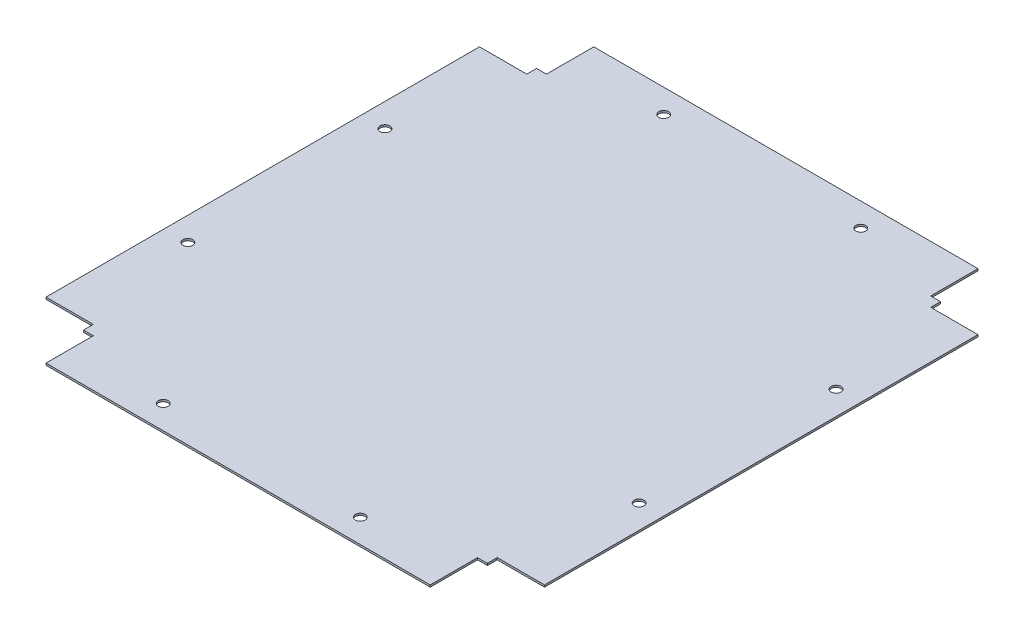
ISO-10303-21;
HEADER;
FILE_DESCRIPTION(('STEP AP214'),'2;1');
FILE_NAME('part.step','',(''),(''),'','','');
FILE_SCHEMA(('AUTOMOTIVE_DESIGN { 1 0 10303 214 1 1 1 1 }'));
ENDSEC;
DATA;
#1=APPLICATION_CONTEXT('core data for automotive mechanical design processes');
#2=APPLICATION_PROTOCOL_DEFINITION('international standard','automotive_design',2000,#1);
#3=PRODUCT_CONTEXT('',#1,'mechanical');
#4=PRODUCT('Part','Part','',(#3));
#5=PRODUCT_RELATED_PRODUCT_CATEGORY('part','',(#4));
#6=PRODUCT_DEFINITION_FORMATION('','',#4);
#7=PRODUCT_DEFINITION_CONTEXT('part definition',#1,'design');
#8=PRODUCT_DEFINITION('design','',#6,#7);
#9=PRODUCT_DEFINITION_SHAPE('','',#8);
#10=(LENGTH_UNIT() NAMED_UNIT(*) SI_UNIT(.MILLI.,.METRE.));
#11=(NAMED_UNIT(*) PLANE_ANGLE_UNIT() SI_UNIT($,.RADIAN.));
#12=(NAMED_UNIT(*) SI_UNIT($,.STERADIAN.) SOLID_ANGLE_UNIT());
#13=UNCERTAINTY_MEASURE_WITH_UNIT(LENGTH_MEASURE(1.E-05),#10,'distance_accuracy_value','');
#14=(GEOMETRIC_REPRESENTATION_CONTEXT(3) GLOBAL_UNCERTAINTY_ASSIGNED_CONTEXT((#13)) GLOBAL_UNIT_ASSIGNED_CONTEXT((#10,
#11,#12)) REPRESENTATION_CONTEXT('',''));
#15=CARTESIAN_POINT('',(0.,0.,0.));
#16=DIRECTION('',(0.,0.,1.));
#17=DIRECTION('',(1.,0.,0.));
#18=AXIS2_PLACEMENT_3D('',#15,#16,#17);
#19=CARTESIAN_POINT('',(0.,1.,0.));
#20=DIRECTION('',(0.,1.,0.));
#21=DIRECTION('',(0.,0.,1.));
#22=AXIS2_PLACEMENT_3D('',#19,#20,#21);
#23=PLANE('',#22);
#24=CARTESIAN_POINT('',(50.,1.,127.));
#25=DIRECTION('',(0.,1.,0.));
#26=DIRECTION('',(0.,0.,1.));
#27=AXIS2_PLACEMENT_3D('',#24,#25,#26);
#28=CIRCLE('',#27,2.5);
#29=CARTESIAN_POINT('',(50.,1.,129.5));
#30=VERTEX_POINT('',#29);
#31=EDGE_CURVE('E411',#30,#30,#28,.T.);
#32=ORIENTED_EDGE('',*,*,#31,.F.);
#33=EDGE_LOOP('',(#32));
#34=FACE_BOUND('',#33,.T.);
#35=CARTESIAN_POINT('',(114.5,1.,-50.));
#36=DIRECTION('',(0.,1.,0.));
#37=DIRECTION('',(0.,0.,1.));
#38=AXIS2_PLACEMENT_3D('',#35,#36,#37);
#39=CIRCLE('',#38,2.5);
#40=CARTESIAN_POINT('',(114.5,1.,-47.5));
#41=VERTEX_POINT('',#40);
#42=EDGE_CURVE('E423',#41,#41,#39,.T.);
#43=ORIENTED_EDGE('',*,*,#42,.F.);
#44=EDGE_LOOP('',(#43));
#45=FACE_BOUND('',#44,.T.);
#46=CARTESIAN_POINT('',(-50.,1.,-127.));
#47=DIRECTION('',(0.,1.,0.));
#48=DIRECTION('',(0.,0.,1.));
#49=AXIS2_PLACEMENT_3D('',#46,#47,#48);
#50=CIRCLE('',#49,2.5);
#51=CARTESIAN_POINT('',(-50.,1.,-124.5));
#52=VERTEX_POINT('',#51);
#53=EDGE_CURVE('E435',#52,#52,#50,.T.);
#54=ORIENTED_EDGE('',*,*,#53,.F.);
#55=EDGE_LOOP('',(#54));
#56=FACE_BOUND('',#55,.T.);
#57=CARTESIAN_POINT('',(-114.5,1.,50.));
#58=DIRECTION('',(0.,1.,0.));
#59=DIRECTION('',(0.,0.,1.));
#60=AXIS2_PLACEMENT_3D('',#57,#58,#59);
#61=CIRCLE('',#60,2.50000000000001);
#62=CARTESIAN_POINT('',(-114.5,1.,52.5));
#63=VERTEX_POINT('',#62);
#64=EDGE_CURVE('E206',#63,#63,#61,.T.);
#65=ORIENTED_EDGE('',*,*,#64,.F.);
#66=EDGE_LOOP('',(#65));
#67=FACE_BOUND('',#66,.T.);
#68=DIRECTION('',(1.,0.,0.));
#69=VECTOR('',#68,1.);
#70=CARTESIAN_POINT('',(102.5,1.,115.));
#71=LINE('',#70,#69);
#72=CARTESIAN_POINT('',(97.5,1.,115.));
#73=VERTEX_POINT('',#72);
#74=CARTESIAN_POINT('',(102.5,1.,115.));
#75=VERTEX_POINT('',#74);
#76=EDGE_CURVE('E241',#73,#75,#71,.T.);
#77=ORIENTED_EDGE('',*,*,#76,.T.);
#78=DIRECTION('',(0.,0.,-1.));
#79=VECTOR('',#78,1.);
#80=CARTESIAN_POINT('',(102.5,1.,110.));
#81=LINE('',#80,#79);
#82=CARTESIAN_POINT('',(102.5,1.,110.));
#83=VERTEX_POINT('',#82);
#84=EDGE_CURVE('E129',#75,#83,#81,.T.);
#85=ORIENTED_EDGE('',*,*,#84,.T.);
#86=DIRECTION('',(1.,0.,0.));
#87=VECTOR('',#86,1.);
#88=CARTESIAN_POINT('',(126.5,1.,110.));
#89=LINE('',#88,#87);
#90=CARTESIAN_POINT('',(126.5,1.,110.));
#91=VERTEX_POINT('',#90);
#92=EDGE_CURVE('E292',#83,#91,#89,.T.);
#93=ORIENTED_EDGE('',*,*,#92,.T.);
#94=DIRECTION('',(0.,0.,-1.));
#95=VECTOR('',#94,1.);
#96=CARTESIAN_POINT('',(126.5,1.,-110.));
#97=LINE('',#96,#95);
#98=CARTESIAN_POINT('',(126.5,1.,-110.));
#99=VERTEX_POINT('',#98);
#100=EDGE_CURVE('E311',#91,#99,#97,.T.);
#101=ORIENTED_EDGE('',*,*,#100,.T.);
#102=DIRECTION('',(-1.,0.,0.));
#103=VECTOR('',#102,1.);
#104=CARTESIAN_POINT('',(102.5,1.,-110.));
#105=LINE('',#104,#103);
#106=CARTESIAN_POINT('',(102.5,1.,-110.));
#107=VERTEX_POINT('',#106);
#108=EDGE_CURVE('E308',#99,#107,#105,.T.);
#109=ORIENTED_EDGE('',*,*,#108,.T.);
#110=DIRECTION('',(0.,0.,-1.));
#111=VECTOR('',#110,1.);
#112=CARTESIAN_POINT('',(102.5,1.,-115.));
#113=LINE('',#112,#111);
#114=CARTESIAN_POINT('',(102.5,1.,-115.));
#115=VERTEX_POINT('',#114);
#116=EDGE_CURVE('E310',#107,#115,#113,.T.);
#117=ORIENTED_EDGE('',*,*,#116,.T.);
#118=DIRECTION('',(-1.,0.,0.));
#119=VECTOR('',#118,1.);
#120=CARTESIAN_POINT('',(97.5,1.,-115.));
#121=LINE('',#120,#119);
#122=CARTESIAN_POINT('',(97.5,1.,-115.));
#123=VERTEX_POINT('',#122);
#124=EDGE_CURVE('E313',#115,#123,#121,.T.);
#125=ORIENTED_EDGE('',*,*,#124,.T.);
#126=DIRECTION('',(0.,0.,-1.));
#127=VECTOR('',#126,1.);
#128=CARTESIAN_POINT('',(97.5,1.,-139.));
#129=LINE('',#128,#127);
#130=CARTESIAN_POINT('',(97.5,1.,-139.));
#131=VERTEX_POINT('',#130);
#132=EDGE_CURVE('E319',#123,#131,#129,.T.);
#133=ORIENTED_EDGE('',*,*,#132,.T.);
#134=DIRECTION('',(-1.,0.,0.));
#135=VECTOR('',#134,1.);
#136=CARTESIAN_POINT('',(-97.5,1.,-139.));
#137=LINE('',#136,#135);
#138=CARTESIAN_POINT('',(-97.5,1.,-139.));
#139=VERTEX_POINT('',#138);
#140=EDGE_CURVE('E321',#131,#139,#137,.T.);
#141=ORIENTED_EDGE('',*,*,#140,.T.);
#142=DIRECTION('',(0.,0.,1.));
#143=VECTOR('',#142,1.);
#144=CARTESIAN_POINT('',(-97.5,1.,-115.));
#145=LINE('',#144,#143);
#146=CARTESIAN_POINT('',(-97.5,1.,-115.));
#147=VERTEX_POINT('',#146);
#148=EDGE_CURVE('E323',#139,#147,#145,.T.);
#149=ORIENTED_EDGE('',*,*,#148,.T.);
#150=DIRECTION('',(-1.,0.,0.));
#151=VECTOR('',#150,1.);
#152=CARTESIAN_POINT('',(-102.5,1.,-115.));
#153=LINE('',#152,#151);
#154=CARTESIAN_POINT('',(-102.5,1.,-115.));
#155=VERTEX_POINT('',#154);
#156=EDGE_CURVE('E325',#147,#155,#153,.T.);
#157=ORIENTED_EDGE('',*,*,#156,.T.);
#158=DIRECTION('',(0.,0.,1.));
#159=VECTOR('',#158,1.);
#160=CARTESIAN_POINT('',(-102.5,1.,-110.));
#161=LINE('',#160,#159);
#162=CARTESIAN_POINT('',(-102.5,1.,-110.));
#163=VERTEX_POINT('',#162);
#164=EDGE_CURVE('E327',#155,#163,#161,.T.);
#165=ORIENTED_EDGE('',*,*,#164,.T.);
#166=DIRECTION('',(-1.,0.,0.));
#167=VECTOR('',#166,1.);
#168=CARTESIAN_POINT('',(-126.5,1.,-110.));
#169=LINE('',#168,#167);
#170=CARTESIAN_POINT('',(-126.5,1.,-110.));
#171=VERTEX_POINT('',#170);
#172=EDGE_CURVE('E329',#163,#171,#169,.T.);
#173=ORIENTED_EDGE('',*,*,#172,.T.);
#174=DIRECTION('',(0.,0.,1.));
#175=VECTOR('',#174,1.);
#176=CARTESIAN_POINT('',(-126.5,1.,110.));
#177=LINE('',#176,#175);
#178=CARTESIAN_POINT('',(-126.5,1.,110.));
#179=VERTEX_POINT('',#178);
#180=EDGE_CURVE('E331',#171,#179,#177,.T.);
#181=ORIENTED_EDGE('',*,*,#180,.T.);
#182=DIRECTION('',(1.,0.,0.));
#183=VECTOR('',#182,1.);
#184=CARTESIAN_POINT('',(-102.5,1.,110.));
#185=LINE('',#184,#183);
#186=CARTESIAN_POINT('',(-102.5,1.,110.));
#187=VERTEX_POINT('',#186);
#188=EDGE_CURVE('E333',#179,#187,#185,.T.);
#189=ORIENTED_EDGE('',*,*,#188,.T.);
#190=DIRECTION('',(0.,0.,1.));
#191=VECTOR('',#190,1.);
#192=CARTESIAN_POINT('',(-102.5,1.,115.));
#193=LINE('',#192,#191);
#194=CARTESIAN_POINT('',(-102.5,1.,115.));
#195=VERTEX_POINT('',#194);
#196=EDGE_CURVE('E335',#187,#195,#193,.T.);
#197=ORIENTED_EDGE('',*,*,#196,.T.);
#198=DIRECTION('',(1.,0.,0.));
#199=VECTOR('',#198,1.);
#200=CARTESIAN_POINT('',(-97.5,1.,115.));
#201=LINE('',#200,#199);
#202=CARTESIAN_POINT('',(-97.5,1.,115.));
#203=VERTEX_POINT('',#202);
#204=EDGE_CURVE('E184',#195,#203,#201,.T.);
#205=ORIENTED_EDGE('',*,*,#204,.T.);
#206=DIRECTION('',(0.,0.,1.));
#207=VECTOR('',#206,1.);
#208=CARTESIAN_POINT('',(-97.5,1.,139.));
#209=LINE('',#208,#207);
#210=CARTESIAN_POINT('',(-97.5,1.,139.));
#211=VERTEX_POINT('',#210);
#212=EDGE_CURVE('E178',#203,#211,#209,.T.);
#213=ORIENTED_EDGE('',*,*,#212,.T.);
#214=DIRECTION('',(1.,0.,0.));
#215=VECTOR('',#214,1.);
#216=CARTESIAN_POINT('',(97.5,1.,139.));
#217=LINE('',#216,#215);
#218=CARTESIAN_POINT('',(97.5,1.,139.));
#219=VERTEX_POINT('',#218);
#220=EDGE_CURVE('E182',#211,#219,#217,.T.);
#221=ORIENTED_EDGE('',*,*,#220,.T.);
#222=DIRECTION('',(0.,0.,-1.));
#223=VECTOR('',#222,1.);
#224=CARTESIAN_POINT('',(97.5,1.,115.));
#225=LINE('',#224,#223);
#226=EDGE_CURVE('E50',#219,#73,#225,.T.);
#227=ORIENTED_EDGE('',*,*,#226,.T.);
#228=EDGE_LOOP('',(#77,#85,#93,#101,#109,#117,#125,#133,#141,#149,#157,#165,#173,#181,#189,#197,
#205,#213,#221,#227));
#229=FACE_BOUND('',#228,.T.);
#230=CARTESIAN_POINT('',(-114.5,1.,-50.));
#231=DIRECTION('',(0.,1.,0.));
#232=DIRECTION('',(0.,0.,1.));
#233=AXIS2_PLACEMENT_3D('',#230,#231,#232);
#234=CIRCLE('',#233,2.5);
#235=CARTESIAN_POINT('',(-114.5,1.,-47.5));
#236=VERTEX_POINT('',#235);
#237=EDGE_CURVE('E441',#236,#236,#234,.T.);
#238=ORIENTED_EDGE('',*,*,#237,.F.);
#239=EDGE_LOOP('',(#238));
#240=FACE_BOUND('',#239,.T.);
#241=CARTESIAN_POINT('',(50.,1.,-127.));
#242=DIRECTION('',(0.,1.,0.));
#243=DIRECTION('',(0.,0.,1.));
#244=AXIS2_PLACEMENT_3D('',#241,#242,#243);
#245=CIRCLE('',#244,2.5);
#246=CARTESIAN_POINT('',(50.,1.,-124.5));
#247=VERTEX_POINT('',#246);
#248=EDGE_CURVE('E429',#247,#247,#245,.T.);
#249=ORIENTED_EDGE('',*,*,#248,.F.);
#250=EDGE_LOOP('',(#249));
#251=FACE_BOUND('',#250,.T.);
#252=CARTESIAN_POINT('',(114.5,1.,50.));
#253=DIRECTION('',(0.,1.,0.));
#254=DIRECTION('',(0.,0.,1.));
#255=AXIS2_PLACEMENT_3D('',#252,#253,#254);
#256=CIRCLE('',#255,2.5);
#257=CARTESIAN_POINT('',(114.5,1.,52.5));
#258=VERTEX_POINT('',#257);
#259=EDGE_CURVE('E417',#258,#258,#256,.T.);
#260=ORIENTED_EDGE('',*,*,#259,.F.);
#261=EDGE_LOOP('',(#260));
#262=FACE_BOUND('',#261,.T.);
#263=CARTESIAN_POINT('',(-50.,1.,127.));
#264=DIRECTION('',(0.,1.,0.));
#265=DIRECTION('',(0.,0.,1.));
#266=AXIS2_PLACEMENT_3D('',#263,#264,#265);
#267=CIRCLE('',#266,2.5);
#268=CARTESIAN_POINT('',(-50.,1.,129.5));
#269=VERTEX_POINT('',#268);
#270=EDGE_CURVE('E402',#269,#269,#267,.T.);
#271=ORIENTED_EDGE('',*,*,#270,.F.);
#272=EDGE_LOOP('',(#271));
#273=FACE_BOUND('',#272,.T.);
#274=ADVANCED_FACE('F33',(#34,#45,#56,#67,#229,#240,#251,#262,#273),#23,.T.);
#275=CARTESIAN_POINT('',(0.,0.,0.));
#276=DIRECTION('',(0.,1.,0.));
#277=DIRECTION('',(0.,0.,1.));
#278=AXIS2_PLACEMENT_3D('',#275,#276,#277);
#279=PLANE('',#278);
#280=DIRECTION('',(1.,0.,0.));
#281=VECTOR('',#280,1.);
#282=CARTESIAN_POINT('',(102.5,0.,115.));
#283=LINE('',#282,#281);
#284=CARTESIAN_POINT('',(97.5,0.,115.));
#285=VERTEX_POINT('',#284);
#286=CARTESIAN_POINT('',(102.5,0.,115.));
#287=VERTEX_POINT('',#286);
#288=EDGE_CURVE('E202',#285,#287,#283,.T.);
#289=ORIENTED_EDGE('',*,*,#288,.F.);
#290=DIRECTION('',(0.,0.,-1.));
#291=VECTOR('',#290,1.);
#292=CARTESIAN_POINT('',(97.5,0.,115.));
#293=LINE('',#292,#291);
#294=CARTESIAN_POINT('',(97.5,0.,139.));
#295=VERTEX_POINT('',#294);
#296=EDGE_CURVE('E121',#295,#285,#293,.T.);
#297=ORIENTED_EDGE('',*,*,#296,.F.);
#298=DIRECTION('',(1.,0.,0.));
#299=VECTOR('',#298,1.);
#300=CARTESIAN_POINT('',(97.5,0.,139.));
#301=LINE('',#300,#299);
#302=CARTESIAN_POINT('',(-97.5,0.,139.));
#303=VERTEX_POINT('',#302);
#304=EDGE_CURVE('E115',#303,#295,#301,.T.);
#305=ORIENTED_EDGE('',*,*,#304,.F.);
#306=DIRECTION('',(0.,0.,1.));
#307=VECTOR('',#306,1.);
#308=CARTESIAN_POINT('',(-97.5,0.,139.));
#309=LINE('',#308,#307);
#310=CARTESIAN_POINT('',(-97.5,0.,115.));
#311=VERTEX_POINT('',#310);
#312=EDGE_CURVE('E192',#311,#303,#309,.T.);
#313=ORIENTED_EDGE('',*,*,#312,.F.);
#314=DIRECTION('',(1.,0.,0.));
#315=VECTOR('',#314,1.);
#316=CARTESIAN_POINT('',(-97.5,0.,115.));
#317=LINE('',#316,#315);
#318=CARTESIAN_POINT('',(-102.5,0.,115.));
#319=VERTEX_POINT('',#318);
#320=EDGE_CURVE('E236',#319,#311,#317,.T.);
#321=ORIENTED_EDGE('',*,*,#320,.F.);
#322=DIRECTION('',(0.,0.,1.));
#323=VECTOR('',#322,1.);
#324=CARTESIAN_POINT('',(-102.5,0.,115.));
#325=LINE('',#324,#323);
#326=CARTESIAN_POINT('',(-102.5,0.,110.));
#327=VERTEX_POINT('',#326);
#328=EDGE_CURVE('E234',#327,#319,#325,.T.);
#329=ORIENTED_EDGE('',*,*,#328,.F.);
#330=DIRECTION('',(1.,0.,0.));
#331=VECTOR('',#330,1.);
#332=CARTESIAN_POINT('',(-102.5,0.,110.));
#333=LINE('',#332,#331);
#334=CARTESIAN_POINT('',(-126.5,0.,110.));
#335=VERTEX_POINT('',#334);
#336=EDGE_CURVE('E232',#335,#327,#333,.T.);
#337=ORIENTED_EDGE('',*,*,#336,.F.);
#338=DIRECTION('',(0.,0.,1.));
#339=VECTOR('',#338,1.);
#340=CARTESIAN_POINT('',(-126.5,0.,110.));
#341=LINE('',#340,#339);
#342=CARTESIAN_POINT('',(-126.5,0.,-110.));
#343=VERTEX_POINT('',#342);
#344=EDGE_CURVE('E230',#343,#335,#341,.T.);
#345=ORIENTED_EDGE('',*,*,#344,.F.);
#346=DIRECTION('',(-1.,0.,0.));
#347=VECTOR('',#346,1.);
#348=CARTESIAN_POINT('',(-126.5,0.,-110.));
#349=LINE('',#348,#347);
#350=CARTESIAN_POINT('',(-102.5,0.,-110.));
#351=VERTEX_POINT('',#350);
#352=EDGE_CURVE('E228',#351,#343,#349,.T.);
#353=ORIENTED_EDGE('',*,*,#352,.F.);
#354=DIRECTION('',(0.,0.,1.));
#355=VECTOR('',#354,1.);
#356=CARTESIAN_POINT('',(-102.5,0.,-110.));
#357=LINE('',#356,#355);
#358=CARTESIAN_POINT('',(-102.5,0.,-115.));
#359=VERTEX_POINT('',#358);
#360=EDGE_CURVE('E226',#359,#351,#357,.T.);
#361=ORIENTED_EDGE('',*,*,#360,.F.);
#362=DIRECTION('',(-1.,0.,0.));
#363=VECTOR('',#362,1.);
#364=CARTESIAN_POINT('',(-102.5,0.,-115.));
#365=LINE('',#364,#363);
#366=CARTESIAN_POINT('',(-97.5,0.,-115.));
#367=VERTEX_POINT('',#366);
#368=EDGE_CURVE('E224',#367,#359,#365,.T.);
#369=ORIENTED_EDGE('',*,*,#368,.F.);
#370=DIRECTION('',(0.,0.,1.));
#371=VECTOR('',#370,1.);
#372=CARTESIAN_POINT('',(-97.5,0.,-115.));
#373=LINE('',#372,#371);
#374=CARTESIAN_POINT('',(-97.5,0.,-139.));
#375=VERTEX_POINT('',#374);
#376=EDGE_CURVE('E222',#375,#367,#373,.T.);
#377=ORIENTED_EDGE('',*,*,#376,.F.);
#378=DIRECTION('',(-1.,0.,0.));
#379=VECTOR('',#378,1.);
#380=CARTESIAN_POINT('',(-97.5,0.,-139.));
#381=LINE('',#380,#379);
#382=CARTESIAN_POINT('',(97.5,0.,-139.));
#383=VERTEX_POINT('',#382);
#384=EDGE_CURVE('E220',#383,#375,#381,.T.);
#385=ORIENTED_EDGE('',*,*,#384,.F.);
#386=DIRECTION('',(0.,0.,-1.));
#387=VECTOR('',#386,1.);
#388=CARTESIAN_POINT('',(97.5,0.,-139.));
#389=LINE('',#388,#387);
#390=CARTESIAN_POINT('',(97.5,0.,-115.));
#391=VERTEX_POINT('',#390);
#392=EDGE_CURVE('E218',#391,#383,#389,.T.);
#393=ORIENTED_EDGE('',*,*,#392,.F.);
#394=DIRECTION('',(-1.,0.,0.));
#395=VECTOR('',#394,1.);
#396=CARTESIAN_POINT('',(97.5,0.,-115.));
#397=LINE('',#396,#395);
#398=CARTESIAN_POINT('',(102.5,0.,-115.));
#399=VERTEX_POINT('',#398);
#400=EDGE_CURVE('E216',#399,#391,#397,.T.);
#401=ORIENTED_EDGE('',*,*,#400,.F.);
#402=DIRECTION('',(0.,0.,-1.));
#403=VECTOR('',#402,1.);
#404=CARTESIAN_POINT('',(102.5,0.,-115.));
#405=LINE('',#404,#403);
#406=CARTESIAN_POINT('',(102.5,0.,-110.));
#407=VERTEX_POINT('',#406);
#408=EDGE_CURVE('E214',#407,#399,#405,.T.);
#409=ORIENTED_EDGE('',*,*,#408,.F.);
#410=DIRECTION('',(-1.,0.,0.));
#411=VECTOR('',#410,1.);
#412=CARTESIAN_POINT('',(102.5,0.,-110.));
#413=LINE('',#412,#411);
#414=CARTESIAN_POINT('',(126.5,0.,-110.));
#415=VERTEX_POINT('',#414);
#416=EDGE_CURVE('E212',#415,#407,#413,.T.);
#417=ORIENTED_EDGE('',*,*,#416,.F.);
#418=DIRECTION('',(0.,0.,-1.));
#419=VECTOR('',#418,1.);
#420=CARTESIAN_POINT('',(126.5,0.,-110.));
#421=LINE('',#420,#419);
#422=CARTESIAN_POINT('',(126.5,0.,110.));
#423=VERTEX_POINT('',#422);
#424=EDGE_CURVE('E210',#423,#415,#421,.T.);
#425=ORIENTED_EDGE('',*,*,#424,.F.);
#426=DIRECTION('',(1.,0.,0.));
#427=VECTOR('',#426,1.);
#428=CARTESIAN_POINT('',(126.5,0.,110.));
#429=LINE('',#428,#427);
#430=CARTESIAN_POINT('',(102.5,0.,110.));
#431=VERTEX_POINT('',#430);
#432=EDGE_CURVE('E208',#431,#423,#429,.T.);
#433=ORIENTED_EDGE('',*,*,#432,.F.);
#434=DIRECTION('',(0.,0.,-1.));
#435=VECTOR('',#434,1.);
#436=CARTESIAN_POINT('',(102.5,0.,110.));
#437=LINE('',#436,#435);
#438=EDGE_CURVE('E205',#287,#431,#437,.T.);
#439=ORIENTED_EDGE('',*,*,#438,.F.);
#440=EDGE_LOOP('',(#289,#297,#305,#313,#321,#329,#337,#345,#353,#361,#369,#377,#385,#393,#401,
#409,#417,#425,#433,#439));
#441=FACE_BOUND('',#440,.T.);
#442=CARTESIAN_POINT('',(-114.5,0.,50.));
#443=DIRECTION('',(0.,1.,0.));
#444=DIRECTION('',(0.,0.,1.));
#445=AXIS2_PLACEMENT_3D('',#442,#443,#444);
#446=CIRCLE('',#445,2.50000000000001);
#447=CARTESIAN_POINT('',(-114.5,0.,52.5));
#448=VERTEX_POINT('',#447);
#449=EDGE_CURVE('E444',#448,#448,#446,.T.);
#450=ORIENTED_EDGE('',*,*,#449,.T.);
#451=EDGE_LOOP('',(#450));
#452=FACE_BOUND('',#451,.T.);
#453=CARTESIAN_POINT('',(-114.5,0.,-50.));
#454=DIRECTION('',(0.,1.,0.));
#455=DIRECTION('',(0.,0.,1.));
#456=AXIS2_PLACEMENT_3D('',#453,#454,#455);
#457=CIRCLE('',#456,2.5);
#458=CARTESIAN_POINT('',(-114.5,0.,-47.5));
#459=VERTEX_POINT('',#458);
#460=EDGE_CURVE('E438',#459,#459,#457,.T.);
#461=ORIENTED_EDGE('',*,*,#460,.T.);
#462=EDGE_LOOP('',(#461));
#463=FACE_BOUND('',#462,.T.);
#464=CARTESIAN_POINT('',(-50.,0.,-127.));
#465=DIRECTION('',(0.,1.,0.));
#466=DIRECTION('',(0.,0.,1.));
#467=AXIS2_PLACEMENT_3D('',#464,#465,#466);
#468=CIRCLE('',#467,2.5);
#469=CARTESIAN_POINT('',(-50.,0.,-124.5));
#470=VERTEX_POINT('',#469);
#471=EDGE_CURVE('E432',#470,#470,#468,.T.);
#472=ORIENTED_EDGE('',*,*,#471,.T.);
#473=EDGE_LOOP('',(#472));
#474=FACE_BOUND('',#473,.T.);
#475=CARTESIAN_POINT('',(50.,0.,-127.));
#476=DIRECTION('',(0.,1.,0.));
#477=DIRECTION('',(0.,0.,1.));
#478=AXIS2_PLACEMENT_3D('',#475,#476,#477);
#479=CIRCLE('',#478,2.5);
#480=CARTESIAN_POINT('',(50.,0.,-124.5));
#481=VERTEX_POINT('',#480);
#482=EDGE_CURVE('E426',#481,#481,#479,.T.);
#483=ORIENTED_EDGE('',*,*,#482,.T.);
#484=EDGE_LOOP('',(#483));
#485=FACE_BOUND('',#484,.T.);
#486=CARTESIAN_POINT('',(114.5,0.,-50.));
#487=DIRECTION('',(0.,1.,0.));
#488=DIRECTION('',(0.,0.,1.));
#489=AXIS2_PLACEMENT_3D('',#486,#487,#488);
#490=CIRCLE('',#489,2.5);
#491=CARTESIAN_POINT('',(114.5,0.,-47.5));
#492=VERTEX_POINT('',#491);
#493=EDGE_CURVE('E420',#492,#492,#490,.T.);
#494=ORIENTED_EDGE('',*,*,#493,.T.);
#495=EDGE_LOOP('',(#494));
#496=FACE_BOUND('',#495,.T.);
#497=CARTESIAN_POINT('',(114.5,0.,50.));
#498=DIRECTION('',(0.,1.,0.));
#499=DIRECTION('',(0.,0.,1.));
#500=AXIS2_PLACEMENT_3D('',#497,#498,#499);
#501=CIRCLE('',#500,2.5);
#502=CARTESIAN_POINT('',(114.5,0.,52.5));
#503=VERTEX_POINT('',#502);
#504=EDGE_CURVE('E414',#503,#503,#501,.T.);
#505=ORIENTED_EDGE('',*,*,#504,.T.);
#506=EDGE_LOOP('',(#505));
#507=FACE_BOUND('',#506,.T.);
#508=CARTESIAN_POINT('',(50.,0.,127.));
#509=DIRECTION('',(0.,1.,0.));
#510=DIRECTION('',(0.,0.,1.));
#511=AXIS2_PLACEMENT_3D('',#508,#509,#510);
#512=CIRCLE('',#511,2.5);
#513=CARTESIAN_POINT('',(50.,0.,129.5));
#514=VERTEX_POINT('',#513);
#515=EDGE_CURVE('E408',#514,#514,#512,.T.);
#516=ORIENTED_EDGE('',*,*,#515,.T.);
#517=EDGE_LOOP('',(#516));
#518=FACE_BOUND('',#517,.T.);
#519=CARTESIAN_POINT('',(-50.,0.,127.));
#520=DIRECTION('',(0.,1.,0.));
#521=DIRECTION('',(0.,0.,1.));
#522=AXIS2_PLACEMENT_3D('',#519,#520,#521);
#523=CIRCLE('',#522,2.5);
#524=CARTESIAN_POINT('',(-50.,0.,129.5));
#525=VERTEX_POINT('',#524);
#526=EDGE_CURVE('E405',#525,#525,#523,.T.);
#527=ORIENTED_EDGE('',*,*,#526,.T.);
#528=EDGE_LOOP('',(#527));
#529=FACE_BOUND('',#528,.T.);
#530=ADVANCED_FACE('F296',(#441,#452,#463,#474,#485,#496,#507,#518,#529),#279,.F.);
#531=CARTESIAN_POINT('',(102.5,1.,115.));
#532=DIRECTION('',(0.,0.,-1.));
#533=DIRECTION('',(-1.,0.,0.));
#534=AXIS2_PLACEMENT_3D('',#531,#532,#533);
#535=PLANE('',#534);
#536=ORIENTED_EDGE('',*,*,#288,.T.);
#537=DIRECTION('',(0.,-1.,0.));
#538=VECTOR('',#537,1.);
#539=CARTESIAN_POINT('',(102.5,1.,115.));
#540=LINE('',#539,#538);
#541=EDGE_CURVE('E11',#75,#287,#540,.T.);
#542=ORIENTED_EDGE('',*,*,#541,.F.);
#543=ORIENTED_EDGE('',*,*,#76,.F.);
#544=DIRECTION('',(0.,-1.,0.));
#545=VECTOR('',#544,1.);
#546=CARTESIAN_POINT('',(97.5,1.,115.));
#547=LINE('',#546,#545);
#548=EDGE_CURVE('E198',#73,#285,#547,.T.);
#549=ORIENTED_EDGE('',*,*,#548,.T.);
#550=EDGE_LOOP('',(#536,#542,#543,#549));
#551=FACE_BOUND('',#550,.T.);
#552=ADVANCED_FACE('F35',(#551),#535,.F.);
#553=CARTESIAN_POINT('',(102.5,1.,110.));
#554=DIRECTION('',(-1.,0.,0.));
#555=DIRECTION('',(0.,0.,1.));
#556=AXIS2_PLACEMENT_3D('',#553,#554,#555);
#557=PLANE('',#556);
#558=ORIENTED_EDGE('',*,*,#438,.T.);
#559=DIRECTION('',(0.,-1.,0.));
#560=VECTOR('',#559,1.);
#561=CARTESIAN_POINT('',(102.5,1.,110.));
#562=LINE('',#561,#560);
#563=EDGE_CURVE('E42',#83,#431,#562,.T.);
#564=ORIENTED_EDGE('',*,*,#563,.F.);
#565=ORIENTED_EDGE('',*,*,#84,.F.);
#566=ORIENTED_EDGE('',*,*,#541,.T.);
#567=EDGE_LOOP('',(#558,#564,#565,#566));
#568=FACE_BOUND('',#567,.T.);
#569=ADVANCED_FACE('F670',(#568),#557,.F.);
#570=CARTESIAN_POINT('',(126.5,1.,110.));
#571=DIRECTION('',(0.,0.,-1.));
#572=DIRECTION('',(-1.,0.,0.));
#573=AXIS2_PLACEMENT_3D('',#570,#571,#572);
#574=PLANE('',#573);
#575=ORIENTED_EDGE('',*,*,#432,.T.);
#576=DIRECTION('',(0.,-1.,0.));
#577=VECTOR('',#576,1.);
#578=CARTESIAN_POINT('',(126.5,1.,110.));
#579=LINE('',#578,#577);
#580=EDGE_CURVE('E284',#91,#423,#579,.T.);
#581=ORIENTED_EDGE('',*,*,#580,.F.);
#582=ORIENTED_EDGE('',*,*,#92,.F.);
#583=ORIENTED_EDGE('',*,*,#563,.T.);
#584=EDGE_LOOP('',(#575,#581,#582,#583));
#585=FACE_BOUND('',#584,.T.);
#586=ADVANCED_FACE('F290',(#585),#574,.F.);
#587=CARTESIAN_POINT('',(126.5,1.,-110.));
#588=DIRECTION('',(-1.,0.,0.));
#589=DIRECTION('',(0.,0.,1.));
#590=AXIS2_PLACEMENT_3D('',#587,#588,#589);
#591=PLANE('',#590);
#592=ORIENTED_EDGE('',*,*,#424,.T.);
#593=DIRECTION('',(0.,-1.,0.));
#594=VECTOR('',#593,1.);
#595=CARTESIAN_POINT('',(126.5,1.,-110.));
#596=LINE('',#595,#594);
#597=EDGE_CURVE('E281',#99,#415,#596,.T.);
#598=ORIENTED_EDGE('',*,*,#597,.F.);
#599=ORIENTED_EDGE('',*,*,#100,.F.);
#600=ORIENTED_EDGE('',*,*,#580,.T.);
#601=EDGE_LOOP('',(#592,#598,#599,#600));
#602=FACE_BOUND('',#601,.T.);
#603=ADVANCED_FACE('F302',(#602),#591,.F.);
#604=CARTESIAN_POINT('',(102.5,1.,-110.));
#605=DIRECTION('',(0.,0.,1.));
#606=DIRECTION('',(1.,0.,0.));
#607=AXIS2_PLACEMENT_3D('',#604,#605,#606);
#608=PLANE('',#607);
#609=ORIENTED_EDGE('',*,*,#416,.T.);
#610=DIRECTION('',(0.,-1.,0.));
#611=VECTOR('',#610,1.);
#612=CARTESIAN_POINT('',(102.5,1.,-110.));
#613=LINE('',#612,#611);
#614=EDGE_CURVE('E278',#107,#407,#613,.T.);
#615=ORIENTED_EDGE('',*,*,#614,.F.);
#616=ORIENTED_EDGE('',*,*,#108,.F.);
#617=ORIENTED_EDGE('',*,*,#597,.T.);
#618=EDGE_LOOP('',(#609,#615,#616,#617));
#619=FACE_BOUND('',#618,.T.);
#620=ADVANCED_FACE('F306',(#619),#608,.F.);
#621=CARTESIAN_POINT('',(102.5,1.,-115.));
#622=DIRECTION('',(-1.,0.,0.));
#623=DIRECTION('',(0.,0.,1.));
#624=AXIS2_PLACEMENT_3D('',#621,#622,#623);
#625=PLANE('',#624);
#626=ORIENTED_EDGE('',*,*,#408,.T.);
#627=DIRECTION('',(0.,-1.,0.));
#628=VECTOR('',#627,1.);
#629=CARTESIAN_POINT('',(102.5,1.,-115.));
#630=LINE('',#629,#628);
#631=EDGE_CURVE('E275',#115,#399,#630,.T.);
#632=ORIENTED_EDGE('',*,*,#631,.F.);
#633=ORIENTED_EDGE('',*,*,#116,.F.);
#634=ORIENTED_EDGE('',*,*,#614,.T.);
#635=EDGE_LOOP('',(#626,#632,#633,#634));
#636=FACE_BOUND('',#635,.T.);
#637=ADVANCED_FACE('F635',(#636),#625,.F.);
#638=CARTESIAN_POINT('',(97.5,1.,-115.));
#639=DIRECTION('',(0.,0.,1.));
#640=DIRECTION('',(1.,0.,0.));
#641=AXIS2_PLACEMENT_3D('',#638,#639,#640);
#642=PLANE('',#641);
#643=ORIENTED_EDGE('',*,*,#400,.T.);
#644=DIRECTION('',(0.,-1.,0.));
#645=VECTOR('',#644,1.);
#646=CARTESIAN_POINT('',(97.5,1.,-115.));
#647=LINE('',#646,#645);
#648=EDGE_CURVE('E272',#123,#391,#647,.T.);
#649=ORIENTED_EDGE('',*,*,#648,.F.);
#650=ORIENTED_EDGE('',*,*,#124,.F.);
#651=ORIENTED_EDGE('',*,*,#631,.T.);
#652=EDGE_LOOP('',(#643,#649,#650,#651));
#653=FACE_BOUND('',#652,.T.);
#654=ADVANCED_FACE('F625',(#653),#642,.F.);
#655=CARTESIAN_POINT('',(97.5,1.,-139.));
#656=DIRECTION('',(-1.,0.,0.));
#657=DIRECTION('',(0.,0.,1.));
#658=AXIS2_PLACEMENT_3D('',#655,#656,#657);
#659=PLANE('',#658);
#660=ORIENTED_EDGE('',*,*,#392,.T.);
#661=DIRECTION('',(0.,-1.,0.));
#662=VECTOR('',#661,1.);
#663=CARTESIAN_POINT('',(97.5,1.,-139.));
#664=LINE('',#663,#662);
#665=EDGE_CURVE('E269',#131,#383,#664,.T.);
#666=ORIENTED_EDGE('',*,*,#665,.F.);
#667=ORIENTED_EDGE('',*,*,#132,.F.);
#668=ORIENTED_EDGE('',*,*,#648,.T.);
#669=EDGE_LOOP('',(#660,#666,#667,#668));
#670=FACE_BOUND('',#669,.T.);
#671=ADVANCED_FACE('F615',(#670),#659,.F.);
#672=CARTESIAN_POINT('',(-97.5,1.,-139.));
#673=DIRECTION('',(0.,0.,1.));
#674=DIRECTION('',(1.,0.,0.));
#675=AXIS2_PLACEMENT_3D('',#672,#673,#674);
#676=PLANE('',#675);
#677=ORIENTED_EDGE('',*,*,#384,.T.);
#678=DIRECTION('',(0.,-1.,0.));
#679=VECTOR('',#678,1.);
#680=CARTESIAN_POINT('',(-97.5,1.,-139.));
#681=LINE('',#680,#679);
#682=EDGE_CURVE('E266',#139,#375,#681,.T.);
#683=ORIENTED_EDGE('',*,*,#682,.F.);
#684=ORIENTED_EDGE('',*,*,#140,.F.);
#685=ORIENTED_EDGE('',*,*,#665,.T.);
#686=EDGE_LOOP('',(#677,#683,#684,#685));
#687=FACE_BOUND('',#686,.T.);
#688=ADVANCED_FACE('F605',(#687),#676,.F.);
#689=CARTESIAN_POINT('',(-97.5,1.,-115.));
#690=DIRECTION('',(1.,0.,0.));
#691=DIRECTION('',(0.,0.,-1.));
#692=AXIS2_PLACEMENT_3D('',#689,#690,#691);
#693=PLANE('',#692);
#694=ORIENTED_EDGE('',*,*,#376,.T.);
#695=DIRECTION('',(0.,-1.,0.));
#696=VECTOR('',#695,1.);
#697=CARTESIAN_POINT('',(-97.5,1.,-115.));
#698=LINE('',#697,#696);
#699=EDGE_CURVE('E263',#147,#367,#698,.T.);
#700=ORIENTED_EDGE('',*,*,#699,.F.);
#701=ORIENTED_EDGE('',*,*,#148,.F.);
#702=ORIENTED_EDGE('',*,*,#682,.T.);
#703=EDGE_LOOP('',(#694,#700,#701,#702));
#704=FACE_BOUND('',#703,.T.);
#705=ADVANCED_FACE('F595',(#704),#693,.F.);
#706=CARTESIAN_POINT('',(-102.5,1.,-115.));
#707=DIRECTION('',(0.,0.,1.));
#708=DIRECTION('',(1.,0.,0.));
#709=AXIS2_PLACEMENT_3D('',#706,#707,#708);
#710=PLANE('',#709);
#711=ORIENTED_EDGE('',*,*,#368,.T.);
#712=DIRECTION('',(0.,-1.,0.));
#713=VECTOR('',#712,1.);
#714=CARTESIAN_POINT('',(-102.5,1.,-115.));
#715=LINE('',#714,#713);
#716=EDGE_CURVE('E260',#155,#359,#715,.T.);
#717=ORIENTED_EDGE('',*,*,#716,.F.);
#718=ORIENTED_EDGE('',*,*,#156,.F.);
#719=ORIENTED_EDGE('',*,*,#699,.T.);
#720=EDGE_LOOP('',(#711,#717,#718,#719));
#721=FACE_BOUND('',#720,.T.);
#722=ADVANCED_FACE('F585',(#721),#710,.F.);
#723=CARTESIAN_POINT('',(-102.5,1.,-110.));
#724=DIRECTION('',(1.,0.,0.));
#725=DIRECTION('',(0.,0.,-1.));
#726=AXIS2_PLACEMENT_3D('',#723,#724,#725);
#727=PLANE('',#726);
#728=ORIENTED_EDGE('',*,*,#360,.T.);
#729=DIRECTION('',(0.,-1.,0.));
#730=VECTOR('',#729,1.);
#731=CARTESIAN_POINT('',(-102.5,1.,-110.));
#732=LINE('',#731,#730);
#733=EDGE_CURVE('E257',#163,#351,#732,.T.);
#734=ORIENTED_EDGE('',*,*,#733,.F.);
#735=ORIENTED_EDGE('',*,*,#164,.F.);
#736=ORIENTED_EDGE('',*,*,#716,.T.);
#737=EDGE_LOOP('',(#728,#734,#735,#736));
#738=FACE_BOUND('',#737,.T.);
#739=ADVANCED_FACE('F575',(#738),#727,.F.);
#740=CARTESIAN_POINT('',(-126.5,1.,-110.));
#741=DIRECTION('',(0.,0.,1.));
#742=DIRECTION('',(1.,0.,0.));
#743=AXIS2_PLACEMENT_3D('',#740,#741,#742);
#744=PLANE('',#743);
#745=ORIENTED_EDGE('',*,*,#352,.T.);
#746=DIRECTION('',(0.,-1.,0.));
#747=VECTOR('',#746,1.);
#748=CARTESIAN_POINT('',(-126.5,1.,-110.));
#749=LINE('',#748,#747);
#750=EDGE_CURVE('E254',#171,#343,#749,.T.);
#751=ORIENTED_EDGE('',*,*,#750,.F.);
#752=ORIENTED_EDGE('',*,*,#172,.F.);
#753=ORIENTED_EDGE('',*,*,#733,.T.);
#754=EDGE_LOOP('',(#745,#751,#752,#753));
#755=FACE_BOUND('',#754,.T.);
#756=ADVANCED_FACE('F565',(#755),#744,.F.);
#757=CARTESIAN_POINT('',(-126.5,1.,110.));
#758=DIRECTION('',(1.,0.,0.));
#759=DIRECTION('',(0.,0.,-1.));
#760=AXIS2_PLACEMENT_3D('',#757,#758,#759);
#761=PLANE('',#760);
#762=ORIENTED_EDGE('',*,*,#344,.T.);
#763=DIRECTION('',(0.,-1.,0.));
#764=VECTOR('',#763,1.);
#765=CARTESIAN_POINT('',(-126.5,1.,110.));
#766=LINE('',#765,#764);
#767=EDGE_CURVE('E251',#179,#335,#766,.T.);
#768=ORIENTED_EDGE('',*,*,#767,.F.);
#769=ORIENTED_EDGE('',*,*,#180,.F.);
#770=ORIENTED_EDGE('',*,*,#750,.T.);
#771=EDGE_LOOP('',(#762,#768,#769,#770));
#772=FACE_BOUND('',#771,.T.);
#773=ADVANCED_FACE('F555',(#772),#761,.F.);
#774=CARTESIAN_POINT('',(-102.5,1.,110.));
#775=DIRECTION('',(0.,0.,-1.));
#776=DIRECTION('',(-1.,0.,0.));
#777=AXIS2_PLACEMENT_3D('',#774,#775,#776);
#778=PLANE('',#777);
#779=ORIENTED_EDGE('',*,*,#336,.T.);
#780=DIRECTION('',(0.,-1.,0.));
#781=VECTOR('',#780,1.);
#782=CARTESIAN_POINT('',(-102.5,1.,110.));
#783=LINE('',#782,#781);
#784=EDGE_CURVE('E248',#187,#327,#783,.T.);
#785=ORIENTED_EDGE('',*,*,#784,.F.);
#786=ORIENTED_EDGE('',*,*,#188,.F.);
#787=ORIENTED_EDGE('',*,*,#767,.T.);
#788=EDGE_LOOP('',(#779,#785,#786,#787));
#789=FACE_BOUND('',#788,.T.);
#790=ADVANCED_FACE('F546',(#789),#778,.F.);
#791=CARTESIAN_POINT('',(-102.5,1.,115.));
#792=DIRECTION('',(1.,0.,0.));
#793=DIRECTION('',(0.,0.,-1.));
#794=AXIS2_PLACEMENT_3D('',#791,#792,#793);
#795=PLANE('',#794);
#796=ORIENTED_EDGE('',*,*,#328,.T.);
#797=DIRECTION('',(0.,-1.,0.));
#798=VECTOR('',#797,1.);
#799=CARTESIAN_POINT('',(-102.5,1.,115.));
#800=LINE('',#799,#798);
#801=EDGE_CURVE('E245',#195,#319,#800,.T.);
#802=ORIENTED_EDGE('',*,*,#801,.F.);
#803=ORIENTED_EDGE('',*,*,#196,.F.);
#804=ORIENTED_EDGE('',*,*,#784,.T.);
#805=EDGE_LOOP('',(#796,#802,#803,#804));
#806=FACE_BOUND('',#805,.T.);
#807=ADVANCED_FACE('F341',(#806),#795,.F.);
#808=CARTESIAN_POINT('',(-97.5,1.,115.));
#809=DIRECTION('',(0.,0.,-1.));
#810=DIRECTION('',(-1.,0.,0.));
#811=AXIS2_PLACEMENT_3D('',#808,#809,#810);
#812=PLANE('',#811);
#813=ORIENTED_EDGE('',*,*,#320,.T.);
#814=DIRECTION('',(0.,-1.,0.));
#815=VECTOR('',#814,1.);
#816=CARTESIAN_POINT('',(-97.5,1.,115.));
#817=LINE('',#816,#815);
#818=EDGE_CURVE('E193',#203,#311,#817,.T.);
#819=ORIENTED_EDGE('',*,*,#818,.F.);
#820=ORIENTED_EDGE('',*,*,#204,.F.);
#821=ORIENTED_EDGE('',*,*,#801,.T.);
#822=EDGE_LOOP('',(#813,#819,#820,#821));
#823=FACE_BOUND('',#822,.T.);
#824=ADVANCED_FACE('F345',(#823),#812,.F.);
#825=CARTESIAN_POINT('',(-97.5,1.,139.));
#826=DIRECTION('',(1.,0.,0.));
#827=DIRECTION('',(0.,0.,-1.));
#828=AXIS2_PLACEMENT_3D('',#825,#826,#827);
#829=PLANE('',#828);
#830=ORIENTED_EDGE('',*,*,#312,.T.);
#831=DIRECTION('',(0.,-1.,0.));
#832=VECTOR('',#831,1.);
#833=CARTESIAN_POINT('',(-97.5,1.,139.));
#834=LINE('',#833,#832);
#835=EDGE_CURVE('E189',#211,#303,#834,.T.);
#836=ORIENTED_EDGE('',*,*,#835,.F.);
#837=ORIENTED_EDGE('',*,*,#212,.F.);
#838=ORIENTED_EDGE('',*,*,#818,.T.);
#839=EDGE_LOOP('',(#830,#836,#837,#838));
#840=FACE_BOUND('',#839,.T.);
#841=ADVANCED_FACE('F190',(#840),#829,.F.);
#842=CARTESIAN_POINT('',(97.5,1.,139.));
#843=DIRECTION('',(0.,0.,-1.));
#844=DIRECTION('',(-1.,0.,0.));
#845=AXIS2_PLACEMENT_3D('',#842,#843,#844);
#846=PLANE('',#845);
#847=ORIENTED_EDGE('',*,*,#304,.T.);
#848=DIRECTION('',(0.,-1.,0.));
#849=VECTOR('',#848,1.);
#850=CARTESIAN_POINT('',(97.5,1.,139.));
#851=LINE('',#850,#849);
#852=EDGE_CURVE('E194',#219,#295,#851,.T.);
#853=ORIENTED_EDGE('',*,*,#852,.F.);
#854=ORIENTED_EDGE('',*,*,#220,.F.);
#855=ORIENTED_EDGE('',*,*,#835,.T.);
#856=EDGE_LOOP('',(#847,#853,#854,#855));
#857=FACE_BOUND('',#856,.T.);
#858=ADVANCED_FACE('F196',(#857),#846,.F.);
#859=CARTESIAN_POINT('',(97.5,1.,115.));
#860=DIRECTION('',(-1.,0.,0.));
#861=DIRECTION('',(0.,0.,1.));
#862=AXIS2_PLACEMENT_3D('',#859,#860,#861);
#863=PLANE('',#862);
#864=ORIENTED_EDGE('',*,*,#296,.T.);
#865=ORIENTED_EDGE('',*,*,#548,.F.);
#866=ORIENTED_EDGE('',*,*,#226,.F.);
#867=ORIENTED_EDGE('',*,*,#852,.T.);
#868=EDGE_LOOP('',(#864,#865,#866,#867));
#869=FACE_BOUND('',#868,.T.);
#870=ADVANCED_FACE('F349',(#869),#863,.F.);
#871=CARTESIAN_POINT('',(-114.5,1.,50.));
#872=DIRECTION('',(0.,-1.,0.));
#873=DIRECTION('',(0.,0.,-1.));
#874=AXIS2_PLACEMENT_3D('',#871,#872,#873);
#875=CYLINDRICAL_SURFACE('',#874,2.50000000000001);
#876=ORIENTED_EDGE('',*,*,#64,.T.);
#877=EDGE_LOOP('',(#876));
#878=FACE_BOUND('',#877,.T.);
#879=ORIENTED_EDGE('',*,*,#449,.F.);
#880=EDGE_LOOP('',(#879));
#881=FACE_BOUND('',#880,.T.);
#882=ADVANCED_FACE('F351',(#878,#881),#875,.F.);
#883=CARTESIAN_POINT('',(-114.5,1.,-50.));
#884=DIRECTION('',(0.,-1.,0.));
#885=DIRECTION('',(0.,0.,-1.));
#886=AXIS2_PLACEMENT_3D('',#883,#884,#885);
#887=CYLINDRICAL_SURFACE('',#886,2.5);
#888=ORIENTED_EDGE('',*,*,#237,.T.);
#889=EDGE_LOOP('',(#888));
#890=FACE_BOUND('',#889,.T.);
#891=ORIENTED_EDGE('',*,*,#460,.F.);
#892=EDGE_LOOP('',(#891));
#893=FACE_BOUND('',#892,.T.);
#894=ADVANCED_FACE('F357',(#890,#893),#887,.F.);
#895=CARTESIAN_POINT('',(-50.,1.,-127.));
#896=DIRECTION('',(0.,-1.,0.));
#897=DIRECTION('',(0.,0.,-1.));
#898=AXIS2_PLACEMENT_3D('',#895,#896,#897);
#899=CYLINDRICAL_SURFACE('',#898,2.5);
#900=ORIENTED_EDGE('',*,*,#53,.T.);
#901=EDGE_LOOP('',(#900));
#902=FACE_BOUND('',#901,.T.);
#903=ORIENTED_EDGE('',*,*,#471,.F.);
#904=EDGE_LOOP('',(#903));
#905=FACE_BOUND('',#904,.T.);
#906=ADVANCED_FACE('F373',(#902,#905),#899,.F.);
#907=CARTESIAN_POINT('',(50.,1.,-127.));
#908=DIRECTION('',(0.,-1.,0.));
#909=DIRECTION('',(0.,0.,-1.));
#910=AXIS2_PLACEMENT_3D('',#907,#908,#909);
#911=CYLINDRICAL_SURFACE('',#910,2.5);
#912=ORIENTED_EDGE('',*,*,#248,.T.);
#913=EDGE_LOOP('',(#912));
#914=FACE_BOUND('',#913,.T.);
#915=ORIENTED_EDGE('',*,*,#482,.F.);
#916=EDGE_LOOP('',(#915));
#917=FACE_BOUND('',#916,.T.);
#918=ADVANCED_FACE('F377',(#914,#917),#911,.F.);
#919=CARTESIAN_POINT('',(114.5,1.,-50.));
#920=DIRECTION('',(0.,-1.,0.));
#921=DIRECTION('',(0.,0.,-1.));
#922=AXIS2_PLACEMENT_3D('',#919,#920,#921);
#923=CYLINDRICAL_SURFACE('',#922,2.5);
#924=ORIENTED_EDGE('',*,*,#42,.T.);
#925=EDGE_LOOP('',(#924));
#926=FACE_BOUND('',#925,.T.);
#927=ORIENTED_EDGE('',*,*,#493,.F.);
#928=EDGE_LOOP('',(#927));
#929=FACE_BOUND('',#928,.T.);
#930=ADVANCED_FACE('F381',(#926,#929),#923,.F.);
#931=CARTESIAN_POINT('',(114.5,1.,50.));
#932=DIRECTION('',(0.,-1.,0.));
#933=DIRECTION('',(0.,0.,-1.));
#934=AXIS2_PLACEMENT_3D('',#931,#932,#933);
#935=CYLINDRICAL_SURFACE('',#934,2.5);
#936=ORIENTED_EDGE('',*,*,#259,.T.);
#937=EDGE_LOOP('',(#936));
#938=FACE_BOUND('',#937,.T.);
#939=ORIENTED_EDGE('',*,*,#504,.F.);
#940=EDGE_LOOP('',(#939));
#941=FACE_BOUND('',#940,.T.);
#942=ADVANCED_FACE('F385',(#938,#941),#935,.F.);
#943=CARTESIAN_POINT('',(50.,1.,127.));
#944=DIRECTION('',(0.,-1.,0.));
#945=DIRECTION('',(0.,0.,-1.));
#946=AXIS2_PLACEMENT_3D('',#943,#944,#945);
#947=CYLINDRICAL_SURFACE('',#946,2.5);
#948=ORIENTED_EDGE('',*,*,#31,.T.);
#949=EDGE_LOOP('',(#948));
#950=FACE_BOUND('',#949,.T.);
#951=ORIENTED_EDGE('',*,*,#515,.F.);
#952=EDGE_LOOP('',(#951));
#953=FACE_BOUND('',#952,.T.);
#954=ADVANCED_FACE('F389',(#950,#953),#947,.F.);
#955=CARTESIAN_POINT('',(-50.,1.,127.));
#956=DIRECTION('',(0.,-1.,0.));
#957=DIRECTION('',(0.,0.,-1.));
#958=AXIS2_PLACEMENT_3D('',#955,#956,#957);
#959=CYLINDRICAL_SURFACE('',#958,2.5);
#960=ORIENTED_EDGE('',*,*,#270,.T.);
#961=EDGE_LOOP('',(#960));
#962=FACE_BOUND('',#961,.T.);
#963=ORIENTED_EDGE('',*,*,#526,.F.);
#964=EDGE_LOOP('',(#963));
#965=FACE_BOUND('',#964,.T.);
#966=ADVANCED_FACE('F393',(#962,#965),#959,.F.);
#967=CLOSED_SHELL('',(#274,#530,#552,#569,#586,#603,#620,#637,#654,#671,#688,#705,#722,#739,
#756,#773,#790,#807,#824,#841,#858,#870,#882,#894,#906,#918,#930,#942,#954,#966));
#968=MANIFOLD_SOLID_BREP('B2',#967);
#969=ADVANCED_BREP_SHAPE_REPRESENTATION('',(#18,#968),#14);
#970=SHAPE_DEFINITION_REPRESENTATION(#9,#969);
ENDSEC;
END-ISO-10303-21;
